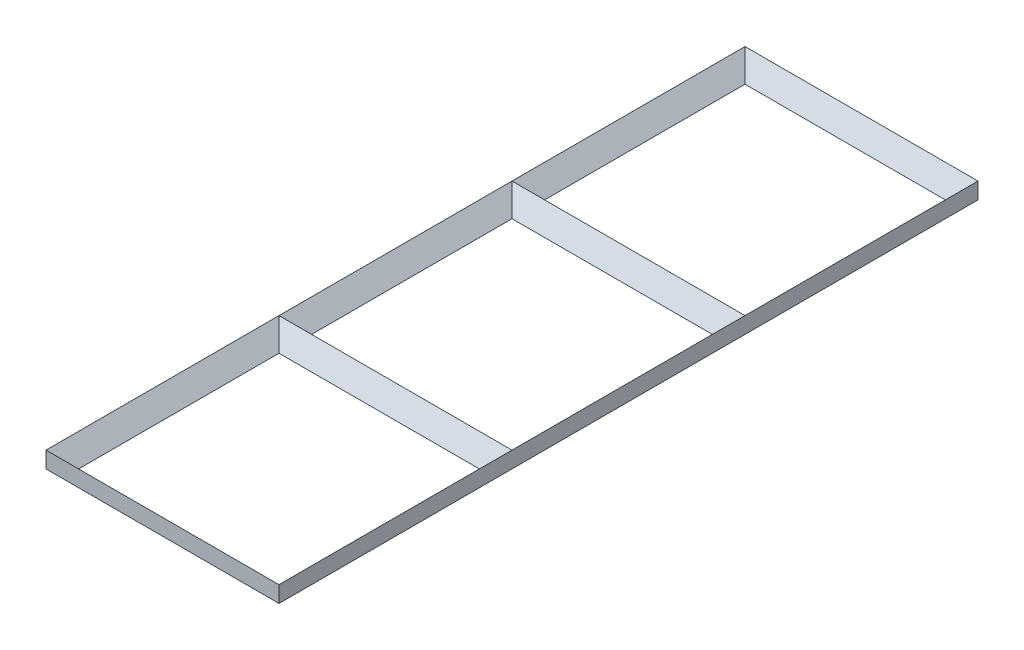
ISO-10303-21;
HEADER;
FILE_DESCRIPTION(('STEP AP214'),'2;1');
FILE_NAME('part.step','',(''),(''),'','','');
FILE_SCHEMA(('AUTOMOTIVE_DESIGN { 1 0 10303 214 1 1 1 1 }'));
ENDSEC;
DATA;
#1=APPLICATION_CONTEXT('core data for automotive mechanical design processes');
#2=APPLICATION_PROTOCOL_DEFINITION('international standard','automotive_design',2000,#1);
#3=PRODUCT_CONTEXT('',#1,'mechanical');
#4=PRODUCT('Part','Part','',(#3));
#5=PRODUCT_RELATED_PRODUCT_CATEGORY('part','',(#4));
#6=PRODUCT_DEFINITION_FORMATION('','',#4);
#7=PRODUCT_DEFINITION_CONTEXT('part definition',#1,'design');
#8=PRODUCT_DEFINITION('design','',#6,#7);
#9=PRODUCT_DEFINITION_SHAPE('','',#8);
#10=(LENGTH_UNIT() NAMED_UNIT(*) SI_UNIT(.MILLI.,.METRE.));
#11=(NAMED_UNIT(*) PLANE_ANGLE_UNIT() SI_UNIT($,.RADIAN.));
#12=(NAMED_UNIT(*) SI_UNIT($,.STERADIAN.) SOLID_ANGLE_UNIT());
#13=UNCERTAINTY_MEASURE_WITH_UNIT(LENGTH_MEASURE(1.E-05),#10,'distance_accuracy_value','');
#14=(GEOMETRIC_REPRESENTATION_CONTEXT(3) GLOBAL_UNCERTAINTY_ASSIGNED_CONTEXT((#13)) GLOBAL_UNIT_ASSIGNED_CONTEXT((#10,
#11,#12)) REPRESENTATION_CONTEXT('',''));
#15=CARTESIAN_POINT('',(0.,0.,0.));
#16=DIRECTION('',(0.,0.,1.));
#17=DIRECTION('',(1.,0.,0.));
#18=AXIS2_PLACEMENT_3D('',#15,#16,#17);
#19=CARTESIAN_POINT('',(50.,3.5,100.));
#20=DIRECTION('',(1.,0.,0.));
#21=DIRECTION('',(0.,0.,-1.));
#22=AXIS2_PLACEMENT_3D('',#19,#20,#21);
#23=PLANE('',#22);
#24=DIRECTION('',(0.,0.,1.));
#25=VECTOR('',#24,1.);
#26=CARTESIAN_POINT('',(50.,0.,100.));
#27=LINE('',#26,#25);
#28=CARTESIAN_POINT('',(50.,0.,-50.));
#29=VERTEX_POINT('',#28);
#30=CARTESIAN_POINT('',(50.,0.,100.));
#31=VERTEX_POINT('',#30);
#32=EDGE_CURVE('E88',#29,#31,#27,.T.);
#33=ORIENTED_EDGE('',*,*,#32,.F.);
#34=DIRECTION('',(0.,-1.,0.));
#35=VECTOR('',#34,1.);
#36=CARTESIAN_POINT('',(50.,3.5,-50.));
#37=LINE('',#36,#35);
#38=CARTESIAN_POINT('',(50.,3.5,-50.));
#39=VERTEX_POINT('',#38);
#40=EDGE_CURVE('E258',#39,#29,#37,.T.);
#41=ORIENTED_EDGE('',*,*,#40,.F.);
#42=DIRECTION('',(0.,0.,1.));
#43=VECTOR('',#42,1.);
#44=CARTESIAN_POINT('',(50.,3.5,0.));
#45=LINE('',#44,#43);
#46=CARTESIAN_POINT('',(50.,3.5,0.));
#47=VERTEX_POINT('',#46);
#48=EDGE_CURVE('E199',#39,#47,#45,.T.);
#49=ORIENTED_EDGE('',*,*,#48,.T.);
#50=DIRECTION('',(0.,0.,1.));
#51=VECTOR('',#50,1.);
#52=CARTESIAN_POINT('',(50.,3.5,50.));
#53=LINE('',#52,#51);
#54=CARTESIAN_POINT('',(50.,3.5,50.));
#55=VERTEX_POINT('',#54);
#56=EDGE_CURVE('E179',#47,#55,#53,.T.);
#57=ORIENTED_EDGE('',*,*,#56,.T.);
#58=DIRECTION('',(0.,0.,1.));
#59=VECTOR('',#58,1.);
#60=CARTESIAN_POINT('',(50.,3.5,100.));
#61=LINE('',#60,#59);
#62=CARTESIAN_POINT('',(50.,3.5,100.));
#63=VERTEX_POINT('',#62);
#64=EDGE_CURVE('E54',#55,#63,#61,.T.);
#65=ORIENTED_EDGE('',*,*,#64,.T.);
#66=DIRECTION('',(0.,-1.,0.));
#67=VECTOR('',#66,1.);
#68=CARTESIAN_POINT('',(50.,3.5,100.));
#69=LINE('',#68,#67);
#70=EDGE_CURVE('E47',#63,#31,#69,.T.);
#71=ORIENTED_EDGE('',*,*,#70,.T.);
#72=EDGE_LOOP('',(#33,#41,#49,#57,#65,#71));
#73=FACE_BOUND('',#72,.T.);
#74=ADVANCED_FACE('F39',(#73),#23,.T.);
#75=CARTESIAN_POINT('',(0.,3.5,100.));
#76=DIRECTION('',(-1.,0.,0.));
#77=DIRECTION('',(0.,0.,1.));
#78=AXIS2_PLACEMENT_3D('',#75,#76,#77);
#79=PLANE('',#78);
#80=DIRECTION('',(0.,0.,-1.));
#81=VECTOR('',#80,1.);
#82=CARTESIAN_POINT('',(0.,0.,100.));
#83=LINE('',#82,#81);
#84=CARTESIAN_POINT('',(0.,0.,100.));
#85=VERTEX_POINT('',#84);
#86=CARTESIAN_POINT('',(0.,0.,-50.));
#87=VERTEX_POINT('',#86);
#88=EDGE_CURVE('E85',#85,#87,#83,.T.);
#89=ORIENTED_EDGE('',*,*,#88,.F.);
#90=DIRECTION('',(0.,-1.,0.));
#91=VECTOR('',#90,1.);
#92=CARTESIAN_POINT('',(0.,3.5,100.));
#93=LINE('',#92,#91);
#94=CARTESIAN_POINT('',(0.,3.5,100.));
#95=VERTEX_POINT('',#94);
#96=EDGE_CURVE('E11',#95,#85,#93,.T.);
#97=ORIENTED_EDGE('',*,*,#96,.F.);
#98=DIRECTION('',(0.,0.,-1.));
#99=VECTOR('',#98,1.);
#100=CARTESIAN_POINT('',(0.,3.5,100.));
#101=LINE('',#100,#99);
#102=CARTESIAN_POINT('',(0.,3.5,50.));
#103=VERTEX_POINT('',#102);
#104=EDGE_CURVE('E100',#95,#103,#101,.T.);
#105=ORIENTED_EDGE('',*,*,#104,.T.);
#106=DIRECTION('',(0.,0.,-1.));
#107=VECTOR('',#106,1.);
#108=CARTESIAN_POINT('',(0.,3.5,50.));
#109=LINE('',#108,#107);
#110=CARTESIAN_POINT('',(0.,3.5,0.));
#111=VERTEX_POINT('',#110);
#112=EDGE_CURVE('E156',#103,#111,#109,.T.);
#113=ORIENTED_EDGE('',*,*,#112,.T.);
#114=DIRECTION('',(0.,0.,-1.));
#115=VECTOR('',#114,1.);
#116=CARTESIAN_POINT('',(0.,3.5,0.));
#117=LINE('',#116,#115);
#118=CARTESIAN_POINT('',(0.,3.5,-50.));
#119=VERTEX_POINT('',#118);
#120=EDGE_CURVE('E224',#111,#119,#117,.T.);
#121=ORIENTED_EDGE('',*,*,#120,.T.);
#122=DIRECTION('',(0.,-1.,0.));
#123=VECTOR('',#122,1.);
#124=CARTESIAN_POINT('',(0.,3.5,-50.));
#125=LINE('',#124,#123);
#126=EDGE_CURVE('E93',#119,#87,#125,.T.);
#127=ORIENTED_EDGE('',*,*,#126,.T.);
#128=EDGE_LOOP('',(#89,#97,#105,#113,#121,#127));
#129=FACE_BOUND('',#128,.T.);
#130=ADVANCED_FACE('F90',(#129),#79,.T.);
#131=CARTESIAN_POINT('',(0.,3.5,100.));
#132=DIRECTION('',(0.,0.,-1.));
#133=DIRECTION('',(-1.,0.,0.));
#134=AXIS2_PLACEMENT_3D('',#131,#132,#133);
#135=PLANE('',#134);
#136=DIRECTION('',(1.,0.,0.));
#137=VECTOR('',#136,1.);
#138=CARTESIAN_POINT('',(0.,0.,100.));
#139=LINE('',#138,#137);
#140=EDGE_CURVE('E71',#85,#31,#139,.T.);
#141=ORIENTED_EDGE('',*,*,#140,.T.);
#142=ORIENTED_EDGE('',*,*,#70,.F.);
#143=DIRECTION('',(1.,0.,0.));
#144=VECTOR('',#143,1.);
#145=CARTESIAN_POINT('',(0.,3.5,100.));
#146=LINE('',#145,#144);
#147=EDGE_CURVE('E75',#95,#63,#146,.T.);
#148=ORIENTED_EDGE('',*,*,#147,.F.);
#149=ORIENTED_EDGE('',*,*,#96,.T.);
#150=EDGE_LOOP('',(#141,#142,#148,#149));
#151=FACE_BOUND('',#150,.T.);
#152=ADVANCED_FACE('F69',(#151),#135,.F.);
#153=CARTESIAN_POINT('',(0.,0.,100.));
#154=DIRECTION('',(0.,1.,0.));
#155=DIRECTION('',(0.,0.,1.));
#156=AXIS2_PLACEMENT_3D('',#153,#154,#155);
#157=PLANE('',#156);
#158=DIRECTION('',(1.,0.,0.));
#159=VECTOR('',#158,1.);
#160=CARTESIAN_POINT('',(0.,0.,96.5));
#161=LINE('',#160,#159);
#162=CARTESIAN_POINT('',(3.5,0.,96.5));
#163=VERTEX_POINT('',#162);
#164=CARTESIAN_POINT('',(46.5,0.,96.5));
#165=VERTEX_POINT('',#164);
#166=EDGE_CURVE('E109',#163,#165,#161,.T.);
#167=ORIENTED_EDGE('',*,*,#166,.T.);
#168=DIRECTION('',(0.,0.,1.));
#169=VECTOR('',#168,1.);
#170=CARTESIAN_POINT('',(46.5,0.,100.));
#171=LINE('',#170,#169);
#172=CARTESIAN_POINT('',(46.5,0.,53.5));
#173=VERTEX_POINT('',#172);
#174=EDGE_CURVE('E96',#173,#165,#171,.T.);
#175=ORIENTED_EDGE('',*,*,#174,.F.);
#176=DIRECTION('',(1.,0.,0.));
#177=VECTOR('',#176,1.);
#178=CARTESIAN_POINT('',(0.,0.,53.5));
#179=LINE('',#178,#177);
#180=CARTESIAN_POINT('',(3.5,0.,53.5));
#181=VERTEX_POINT('',#180);
#182=EDGE_CURVE('E115',#181,#173,#179,.T.);
#183=ORIENTED_EDGE('',*,*,#182,.F.);
#184=DIRECTION('',(0.,0.,-1.));
#185=VECTOR('',#184,1.);
#186=CARTESIAN_POINT('',(3.5,0.,100.));
#187=LINE('',#186,#185);
#188=EDGE_CURVE('E112',#163,#181,#187,.T.);
#189=ORIENTED_EDGE('',*,*,#188,.F.);
#190=EDGE_LOOP('',(#167,#175,#183,#189));
#191=FACE_BOUND('',#190,.T.);
#192=ORIENTED_EDGE('',*,*,#32,.T.);
#193=ORIENTED_EDGE('',*,*,#140,.F.);
#194=ORIENTED_EDGE('',*,*,#88,.T.);
#195=DIRECTION('',(1.,0.,0.));
#196=VECTOR('',#195,1.);
#197=CARTESIAN_POINT('',(0.,0.,-50.));
#198=LINE('',#197,#196);
#199=EDGE_CURVE('E244',#87,#29,#198,.T.);
#200=ORIENTED_EDGE('',*,*,#199,.T.);
#201=EDGE_LOOP('',(#192,#193,#194,#200));
#202=FACE_BOUND('',#201,.T.);
#203=DIRECTION('',(1.,0.,0.));
#204=VECTOR('',#203,1.);
#205=CARTESIAN_POINT('',(0.,0.,46.5));
#206=LINE('',#205,#204);
#207=CARTESIAN_POINT('',(3.5,0.,46.5));
#208=VERTEX_POINT('',#207);
#209=CARTESIAN_POINT('',(46.5,0.,46.5));
#210=VERTEX_POINT('',#209);
#211=EDGE_CURVE('E168',#208,#210,#206,.T.);
#212=ORIENTED_EDGE('',*,*,#211,.T.);
#213=DIRECTION('',(0.,0.,1.));
#214=VECTOR('',#213,1.);
#215=CARTESIAN_POINT('',(46.5,0.,50.));
#216=LINE('',#215,#214);
#217=CARTESIAN_POINT('',(46.5,0.,3.5));
#218=VERTEX_POINT('',#217);
#219=EDGE_CURVE('E182',#218,#210,#216,.T.);
#220=ORIENTED_EDGE('',*,*,#219,.F.);
#221=DIRECTION('',(1.,0.,0.));
#222=VECTOR('',#221,1.);
#223=CARTESIAN_POINT('',(0.,0.,3.5));
#224=LINE('',#223,#222);
#225=CARTESIAN_POINT('',(3.5,0.,3.5));
#226=VERTEX_POINT('',#225);
#227=EDGE_CURVE('E189',#226,#218,#224,.T.);
#228=ORIENTED_EDGE('',*,*,#227,.F.);
#229=DIRECTION('',(0.,0.,-1.));
#230=VECTOR('',#229,1.);
#231=CARTESIAN_POINT('',(3.5,0.,50.));
#232=LINE('',#231,#230);
#233=EDGE_CURVE('E187',#208,#226,#232,.T.);
#234=ORIENTED_EDGE('',*,*,#233,.F.);
#235=EDGE_LOOP('',(#212,#220,#228,#234));
#236=FACE_BOUND('',#235,.T.);
#237=DIRECTION('',(1.,0.,0.));
#238=VECTOR('',#237,1.);
#239=CARTESIAN_POINT('',(0.,0.,-3.5));
#240=LINE('',#239,#238);
#241=CARTESIAN_POINT('',(3.5,0.,-3.5));
#242=VERTEX_POINT('',#241);
#243=CARTESIAN_POINT('',(46.5,0.,-3.5));
#244=VERTEX_POINT('',#243);
#245=EDGE_CURVE('E236',#242,#244,#240,.T.);
#246=ORIENTED_EDGE('',*,*,#245,.T.);
#247=DIRECTION('',(0.,0.,1.));
#248=VECTOR('',#247,1.);
#249=CARTESIAN_POINT('',(46.5,0.,0.));
#250=LINE('',#249,#248);
#251=CARTESIAN_POINT('',(46.5,0.,-46.5));
#252=VERTEX_POINT('',#251);
#253=EDGE_CURVE('E232',#252,#244,#250,.T.);
#254=ORIENTED_EDGE('',*,*,#253,.F.);
#255=DIRECTION('',(1.,0.,0.));
#256=VECTOR('',#255,1.);
#257=CARTESIAN_POINT('',(0.,0.,-46.5));
#258=LINE('',#257,#256);
#259=CARTESIAN_POINT('',(3.5,0.,-46.5));
#260=VERTEX_POINT('',#259);
#261=EDGE_CURVE('E252',#260,#252,#258,.T.);
#262=ORIENTED_EDGE('',*,*,#261,.F.);
#263=DIRECTION('',(0.,0.,-1.));
#264=VECTOR('',#263,1.);
#265=CARTESIAN_POINT('',(3.5,0.,0.));
#266=LINE('',#265,#264);
#267=EDGE_CURVE('E249',#242,#260,#266,.T.);
#268=ORIENTED_EDGE('',*,*,#267,.F.);
#269=EDGE_LOOP('',(#246,#254,#262,#268));
#270=FACE_BOUND('',#269,.T.);
#271=ADVANCED_FACE('F81',(#191,#202,#236,#270),#157,.F.);
#272=CARTESIAN_POINT('',(3.5,0.,100.));
#273=DIRECTION('',(-0.707106781186546,-0.707106781186549,0.));
#274=DIRECTION('',(0.707106781186549,-0.707106781186546,0.));
#275=AXIS2_PLACEMENT_3D('',#272,#273,#274);
#276=PLANE('',#275);
#277=ORIENTED_EDGE('',*,*,#188,.T.);
#278=DIRECTION('',(0.577350269189627,-0.577350269189624,0.577350269189627));
#279=VECTOR('',#278,1.);
#280=CARTESIAN_POINT('',(19.,-15.5,69.));
#281=LINE('',#280,#279);
#282=EDGE_CURVE('E144',#103,#181,#281,.T.);
#283=ORIENTED_EDGE('',*,*,#282,.F.);
#284=ORIENTED_EDGE('',*,*,#104,.F.);
#285=DIRECTION('',(-0.577350269189627,0.577350269189624,0.577350269189627));
#286=VECTOR('',#285,1.);
#287=CARTESIAN_POINT('',(2.33333333333333,1.16666666666667,97.6666666666667));
#288=LINE('',#287,#286);
#289=EDGE_CURVE('E113',#95,#163,#288,.F.);
#290=ORIENTED_EDGE('',*,*,#289,.T.);
#291=EDGE_LOOP('',(#277,#283,#284,#290));
#292=FACE_BOUND('',#291,.T.);
#293=ADVANCED_FACE('F146',(#292),#276,.F.);
#294=CARTESIAN_POINT('',(0.,0.,96.5));
#295=DIRECTION('',(0.,-0.707106781186549,0.707106781186546));
#296=DIRECTION('',(0.,-0.707106781186546,-0.707106781186549));
#297=AXIS2_PLACEMENT_3D('',#294,#295,#296);
#298=PLANE('',#297);
#299=ORIENTED_EDGE('',*,*,#166,.F.);
#300=ORIENTED_EDGE('',*,*,#289,.F.);
#301=ORIENTED_EDGE('',*,*,#147,.T.);
#302=DIRECTION('',(0.577350269189627,0.577350269189624,0.577350269189627));
#303=VECTOR('',#302,1.);
#304=CARTESIAN_POINT('',(31.,-15.5,81.));
#305=LINE('',#304,#303);
#306=EDGE_CURVE('E121',#63,#165,#305,.F.);
#307=ORIENTED_EDGE('',*,*,#306,.T.);
#308=EDGE_LOOP('',(#299,#300,#301,#307));
#309=FACE_BOUND('',#308,.T.);
#310=ADVANCED_FACE('F130',(#309),#298,.F.);
#311=CARTESIAN_POINT('',(46.5,0.,100.));
#312=DIRECTION('',(0.707106781186546,-0.707106781186549,0.));
#313=DIRECTION('',(0.707106781186549,0.707106781186546,0.));
#314=AXIS2_PLACEMENT_3D('',#311,#312,#313);
#315=PLANE('',#314);
#316=ORIENTED_EDGE('',*,*,#174,.T.);
#317=ORIENTED_EDGE('',*,*,#306,.F.);
#318=ORIENTED_EDGE('',*,*,#64,.F.);
#319=DIRECTION('',(-0.577350269189626,-0.577350269189624,0.577350269189627));
#320=VECTOR('',#319,1.);
#321=CARTESIAN_POINT('',(31.,-15.5,69.));
#322=LINE('',#321,#320);
#323=EDGE_CURVE('E123',#55,#173,#322,.T.);
#324=ORIENTED_EDGE('',*,*,#323,.T.);
#325=EDGE_LOOP('',(#316,#317,#318,#324));
#326=FACE_BOUND('',#325,.T.);
#327=ADVANCED_FACE('F120',(#326),#315,.F.);
#328=CARTESIAN_POINT('',(0.,0.,53.5));
#329=DIRECTION('',(0.,-0.707106781186549,-0.707106781186546));
#330=DIRECTION('',(0.,0.707106781186546,-0.707106781186549));
#331=AXIS2_PLACEMENT_3D('',#328,#329,#330);
#332=PLANE('',#331);
#333=ORIENTED_EDGE('',*,*,#182,.T.);
#334=ORIENTED_EDGE('',*,*,#323,.F.);
#335=DIRECTION('',(1.,0.,0.));
#336=VECTOR('',#335,1.);
#337=CARTESIAN_POINT('',(0.,3.5,50.));
#338=LINE('',#337,#336);
#339=EDGE_CURVE('E148',#103,#55,#338,.T.);
#340=ORIENTED_EDGE('',*,*,#339,.F.);
#341=ORIENTED_EDGE('',*,*,#282,.T.);
#342=EDGE_LOOP('',(#333,#334,#340,#341));
#343=FACE_BOUND('',#342,.T.);
#344=ADVANCED_FACE('F151',(#343),#332,.F.);
#345=CARTESIAN_POINT('',(3.5,0.,50.));
#346=DIRECTION('',(-0.707106781186546,-0.707106781186549,0.));
#347=DIRECTION('',(0.707106781186549,-0.707106781186546,0.));
#348=AXIS2_PLACEMENT_3D('',#345,#346,#347);
#349=PLANE('',#348);
#350=ORIENTED_EDGE('',*,*,#233,.T.);
#351=DIRECTION('',(0.577350269189627,-0.577350269189624,0.577350269189627));
#352=VECTOR('',#351,1.);
#353=CARTESIAN_POINT('',(19.,-15.5,19.));
#354=LINE('',#353,#352);
#355=EDGE_CURVE('E177',#111,#226,#354,.T.);
#356=ORIENTED_EDGE('',*,*,#355,.F.);
#357=ORIENTED_EDGE('',*,*,#112,.F.);
#358=DIRECTION('',(-0.577350269189627,0.577350269189624,0.577350269189627));
#359=VECTOR('',#358,1.);
#360=CARTESIAN_POINT('',(2.33333333333333,1.16666666666667,47.6666666666667));
#361=LINE('',#360,#359);
#362=EDGE_CURVE('E164',#103,#208,#361,.F.);
#363=ORIENTED_EDGE('',*,*,#362,.T.);
#364=EDGE_LOOP('',(#350,#356,#357,#363));
#365=FACE_BOUND('',#364,.T.);
#366=ADVANCED_FACE('F175',(#365),#349,.F.);
#367=CARTESIAN_POINT('',(0.,0.,46.5));
#368=DIRECTION('',(0.,-0.707106781186549,0.707106781186546));
#369=DIRECTION('',(0.,-0.707106781186546,-0.707106781186549));
#370=AXIS2_PLACEMENT_3D('',#367,#368,#369);
#371=PLANE('',#370);
#372=ORIENTED_EDGE('',*,*,#211,.F.);
#373=ORIENTED_EDGE('',*,*,#362,.F.);
#374=ORIENTED_EDGE('',*,*,#339,.T.);
#375=DIRECTION('',(0.577350269189627,0.577350269189624,0.577350269189627));
#376=VECTOR('',#375,1.);
#377=CARTESIAN_POINT('',(31.,-15.5,31.));
#378=LINE('',#377,#376);
#379=EDGE_CURVE('E172',#55,#210,#378,.F.);
#380=ORIENTED_EDGE('',*,*,#379,.T.);
#381=EDGE_LOOP('',(#372,#373,#374,#380));
#382=FACE_BOUND('',#381,.T.);
#383=ADVANCED_FACE('F165',(#382),#371,.F.);
#384=CARTESIAN_POINT('',(46.5,0.,50.));
#385=DIRECTION('',(0.707106781186546,-0.707106781186549,0.));
#386=DIRECTION('',(0.707106781186549,0.707106781186546,0.));
#387=AXIS2_PLACEMENT_3D('',#384,#385,#386);
#388=PLANE('',#387);
#389=ORIENTED_EDGE('',*,*,#219,.T.);
#390=ORIENTED_EDGE('',*,*,#379,.F.);
#391=ORIENTED_EDGE('',*,*,#56,.F.);
#392=DIRECTION('',(-0.577350269189626,-0.577350269189624,0.577350269189627));
#393=VECTOR('',#392,1.);
#394=CARTESIAN_POINT('',(31.,-15.5,19.));
#395=LINE('',#394,#393);
#396=EDGE_CURVE('E205',#47,#218,#395,.T.);
#397=ORIENTED_EDGE('',*,*,#396,.T.);
#398=EDGE_LOOP('',(#389,#390,#391,#397));
#399=FACE_BOUND('',#398,.T.);
#400=ADVANCED_FACE('F203',(#399),#388,.F.);
#401=CARTESIAN_POINT('',(0.,0.,3.5));
#402=DIRECTION('',(0.,-0.707106781186549,-0.707106781186546));
#403=DIRECTION('',(0.,0.707106781186546,-0.707106781186549));
#404=AXIS2_PLACEMENT_3D('',#401,#402,#403);
#405=PLANE('',#404);
#406=ORIENTED_EDGE('',*,*,#227,.T.);
#407=ORIENTED_EDGE('',*,*,#396,.F.);
#408=DIRECTION('',(1.,0.,0.));
#409=VECTOR('',#408,1.);
#410=CARTESIAN_POINT('',(0.,3.5,0.));
#411=LINE('',#410,#409);
#412=EDGE_CURVE('E209',#111,#47,#411,.T.);
#413=ORIENTED_EDGE('',*,*,#412,.F.);
#414=ORIENTED_EDGE('',*,*,#355,.T.);
#415=EDGE_LOOP('',(#406,#407,#413,#414));
#416=FACE_BOUND('',#415,.T.);
#417=ADVANCED_FACE('F208',(#416),#405,.F.);
#418=CARTESIAN_POINT('',(0.,3.5,-50.));
#419=DIRECTION('',(0.,0.,-1.));
#420=DIRECTION('',(-1.,0.,0.));
#421=AXIS2_PLACEMENT_3D('',#418,#419,#420);
#422=PLANE('',#421);
#423=ORIENTED_EDGE('',*,*,#199,.F.);
#424=ORIENTED_EDGE('',*,*,#126,.F.);
#425=DIRECTION('',(1.,0.,0.));
#426=VECTOR('',#425,1.);
#427=CARTESIAN_POINT('',(0.,3.5,-50.));
#428=LINE('',#427,#426);
#429=EDGE_CURVE('E243',#119,#39,#428,.T.);
#430=ORIENTED_EDGE('',*,*,#429,.T.);
#431=ORIENTED_EDGE('',*,*,#40,.T.);
#432=EDGE_LOOP('',(#423,#424,#430,#431));
#433=FACE_BOUND('',#432,.T.);
#434=ADVANCED_FACE('F290',(#433),#422,.T.);
#435=CARTESIAN_POINT('',(3.5,0.,0.));
#436=DIRECTION('',(-0.707106781186546,-0.707106781186549,0.));
#437=DIRECTION('',(0.707106781186549,-0.707106781186546,0.));
#438=AXIS2_PLACEMENT_3D('',#435,#436,#437);
#439=PLANE('',#438);
#440=ORIENTED_EDGE('',*,*,#267,.T.);
#441=DIRECTION('',(0.577350269189627,-0.577350269189624,0.577350269189627));
#442=VECTOR('',#441,1.);
#443=CARTESIAN_POINT('',(19.,-15.5,-31.));
#444=LINE('',#443,#442);
#445=EDGE_CURVE('E238',#119,#260,#444,.T.);
#446=ORIENTED_EDGE('',*,*,#445,.F.);
#447=ORIENTED_EDGE('',*,*,#120,.F.);
#448=DIRECTION('',(-0.577350269189627,0.577350269189624,0.577350269189627));
#449=VECTOR('',#448,1.);
#450=CARTESIAN_POINT('',(2.33333333333333,1.16666666666667,-2.33333333333333));
#451=LINE('',#450,#449);
#452=EDGE_CURVE('E222',#111,#242,#451,.F.);
#453=ORIENTED_EDGE('',*,*,#452,.T.);
#454=EDGE_LOOP('',(#440,#446,#447,#453));
#455=FACE_BOUND('',#454,.T.);
#456=ADVANCED_FACE('F282',(#455),#439,.F.);
#457=CARTESIAN_POINT('',(0.,0.,-3.5));
#458=DIRECTION('',(0.,-0.707106781186549,0.707106781186546));
#459=DIRECTION('',(0.,-0.707106781186546,-0.707106781186549));
#460=AXIS2_PLACEMENT_3D('',#457,#458,#459);
#461=PLANE('',#460);
#462=ORIENTED_EDGE('',*,*,#245,.F.);
#463=ORIENTED_EDGE('',*,*,#452,.F.);
#464=ORIENTED_EDGE('',*,*,#412,.T.);
#465=DIRECTION('',(0.577350269189627,0.577350269189624,0.577350269189627));
#466=VECTOR('',#465,1.);
#467=CARTESIAN_POINT('',(31.,-15.5,-19.));
#468=LINE('',#467,#466);
#469=EDGE_CURVE('E219',#47,#244,#468,.F.);
#470=ORIENTED_EDGE('',*,*,#469,.T.);
#471=EDGE_LOOP('',(#462,#463,#464,#470));
#472=FACE_BOUND('',#471,.T.);
#473=ADVANCED_FACE('F217',(#472),#461,.F.);
#474=CARTESIAN_POINT('',(46.5,0.,0.));
#475=DIRECTION('',(0.707106781186546,-0.707106781186549,0.));
#476=DIRECTION('',(0.707106781186549,0.707106781186546,0.));
#477=AXIS2_PLACEMENT_3D('',#474,#475,#476);
#478=PLANE('',#477);
#479=ORIENTED_EDGE('',*,*,#253,.T.);
#480=ORIENTED_EDGE('',*,*,#469,.F.);
#481=ORIENTED_EDGE('',*,*,#48,.F.);
#482=DIRECTION('',(-0.577350269189626,-0.577350269189624,0.577350269189627));
#483=VECTOR('',#482,1.);
#484=CARTESIAN_POINT('',(31.,-15.5,-31.));
#485=LINE('',#484,#483);
#486=EDGE_CURVE('E234',#39,#252,#485,.T.);
#487=ORIENTED_EDGE('',*,*,#486,.T.);
#488=EDGE_LOOP('',(#479,#480,#481,#487));
#489=FACE_BOUND('',#488,.T.);
#490=ADVANCED_FACE('F227',(#489),#478,.F.);
#491=CARTESIAN_POINT('',(0.,0.,-46.5));
#492=DIRECTION('',(0.,-0.707106781186549,-0.707106781186546));
#493=DIRECTION('',(0.,0.707106781186546,-0.707106781186549));
#494=AXIS2_PLACEMENT_3D('',#491,#492,#493);
#495=PLANE('',#494);
#496=ORIENTED_EDGE('',*,*,#261,.T.);
#497=ORIENTED_EDGE('',*,*,#486,.F.);
#498=ORIENTED_EDGE('',*,*,#429,.F.);
#499=ORIENTED_EDGE('',*,*,#445,.T.);
#500=EDGE_LOOP('',(#496,#497,#498,#499));
#501=FACE_BOUND('',#500,.T.);
#502=ADVANCED_FACE('F287',(#501),#495,.F.);
#503=CLOSED_SHELL('',(#74,#130,#152,#271,#293,#310,#327,#344,#366,#383,#400,#417,#434,#456,#473,
#490,#502));
#504=MANIFOLD_SOLID_BREP('B2',#503);
#505=ADVANCED_BREP_SHAPE_REPRESENTATION('',(#18,#504),#14);
#506=SHAPE_DEFINITION_REPRESENTATION(#9,#505);
ENDSEC;
END-ISO-10303-21;
